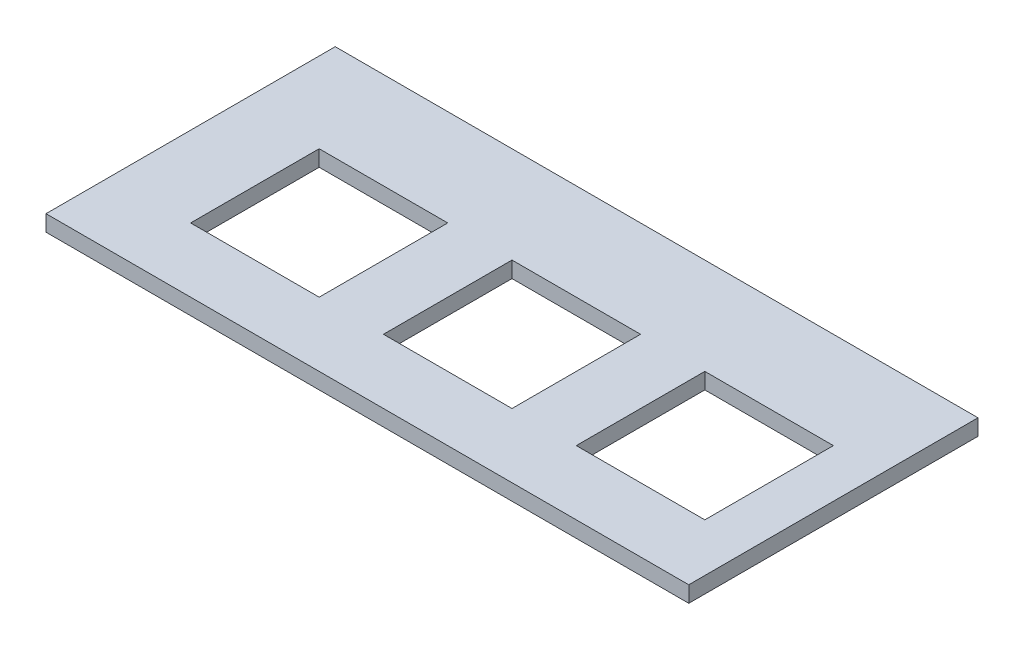
ISO-10303-21;
HEADER;
FILE_DESCRIPTION(('STEP AP214'),'2;1');
FILE_NAME('part.step','',(''),(''),'','','');
FILE_SCHEMA(('AUTOMOTIVE_DESIGN { 1 0 10303 214 1 1 1 1 }'));
ENDSEC;
DATA;
#1=APPLICATION_CONTEXT('core data for automotive mechanical design processes');
#2=APPLICATION_PROTOCOL_DEFINITION('international standard','automotive_design',2000,#1);
#3=PRODUCT_CONTEXT('',#1,'mechanical');
#4=PRODUCT('Part','Part','',(#3));
#5=PRODUCT_RELATED_PRODUCT_CATEGORY('part','',(#4));
#6=PRODUCT_DEFINITION_FORMATION('','',#4);
#7=PRODUCT_DEFINITION_CONTEXT('part definition',#1,'design');
#8=PRODUCT_DEFINITION('design','',#6,#7);
#9=PRODUCT_DEFINITION_SHAPE('','',#8);
#10=(LENGTH_UNIT() NAMED_UNIT(*) SI_UNIT(.MILLI.,.METRE.));
#11=(NAMED_UNIT(*) PLANE_ANGLE_UNIT() SI_UNIT($,.RADIAN.));
#12=(NAMED_UNIT(*) SI_UNIT($,.STERADIAN.) SOLID_ANGLE_UNIT());
#13=UNCERTAINTY_MEASURE_WITH_UNIT(LENGTH_MEASURE(1.E-05),#10,'distance_accuracy_value','');
#14=(GEOMETRIC_REPRESENTATION_CONTEXT(3) GLOBAL_UNCERTAINTY_ASSIGNED_CONTEXT((#13)) GLOBAL_UNIT_ASSIGNED_CONTEXT((#10,
#11,#12)) REPRESENTATION_CONTEXT('',''));
#15=CARTESIAN_POINT('',(0.,0.,0.));
#16=DIRECTION('',(0.,0.,1.));
#17=DIRECTION('',(1.,0.,0.));
#18=AXIS2_PLACEMENT_3D('',#15,#16,#17);
#19=CARTESIAN_POINT('',(0.,10.,0.));
#20=DIRECTION('',(-1.,0.,0.));
#21=DIRECTION('',(0.,0.,1.));
#22=AXIS2_PLACEMENT_3D('',#19,#20,#21);
#23=PLANE('',#22);
#24=DIRECTION('',(0.,0.,-1.));
#25=VECTOR('',#24,1.);
#26=CARTESIAN_POINT('',(0.,0.,0.));
#27=LINE('',#26,#25);
#28=CARTESIAN_POINT('',(0.,0.,0.));
#29=VERTEX_POINT('',#28);
#30=CARTESIAN_POINT('',(0.,0.,-180.));
#31=VERTEX_POINT('',#30);
#32=EDGE_CURVE('E238',#29,#31,#27,.T.);
#33=ORIENTED_EDGE('',*,*,#32,.T.);
#34=DIRECTION('',(0.,-1.,0.));
#35=VECTOR('',#34,1.);
#36=CARTESIAN_POINT('',(0.,10.,-180.));
#37=LINE('',#36,#35);
#38=CARTESIAN_POINT('',(0.,10.,-180.));
#39=VERTEX_POINT('',#38);
#40=EDGE_CURVE('E11',#39,#31,#37,.T.);
#41=ORIENTED_EDGE('',*,*,#40,.F.);
#42=DIRECTION('',(0.,0.,-1.));
#43=VECTOR('',#42,1.);
#44=CARTESIAN_POINT('',(0.,10.,0.));
#45=LINE('',#44,#43);
#46=CARTESIAN_POINT('',(0.,10.,0.));
#47=VERTEX_POINT('',#46);
#48=EDGE_CURVE('E245',#47,#39,#45,.T.);
#49=ORIENTED_EDGE('',*,*,#48,.F.);
#50=DIRECTION('',(0.,-1.,0.));
#51=VECTOR('',#50,1.);
#52=CARTESIAN_POINT('',(0.,10.,0.));
#53=LINE('',#52,#51);
#54=EDGE_CURVE('E255',#47,#29,#53,.T.);
#55=ORIENTED_EDGE('',*,*,#54,.T.);
#56=EDGE_LOOP('',(#33,#41,#49,#55));
#57=FACE_BOUND('',#56,.T.);
#58=ADVANCED_FACE('F32',(#57),#23,.F.);
#59=CARTESIAN_POINT('',(0.,10.,-180.));
#60=DIRECTION('',(0.,0.,1.));
#61=DIRECTION('',(1.,0.,0.));
#62=AXIS2_PLACEMENT_3D('',#59,#60,#61);
#63=PLANE('',#62);
#64=DIRECTION('',(-1.,0.,0.));
#65=VECTOR('',#64,1.);
#66=CARTESIAN_POINT('',(0.,0.,-180.));
#67=LINE('',#66,#65);
#68=CARTESIAN_POINT('',(-400.,0.,-180.));
#69=VERTEX_POINT('',#68);
#70=EDGE_CURVE('E258',#31,#69,#67,.T.);
#71=ORIENTED_EDGE('',*,*,#70,.T.);
#72=DIRECTION('',(0.,-1.,0.));
#73=VECTOR('',#72,1.);
#74=CARTESIAN_POINT('',(-400.,10.,-180.));
#75=LINE('',#74,#73);
#76=CARTESIAN_POINT('',(-400.,10.,-180.));
#77=VERTEX_POINT('',#76);
#78=EDGE_CURVE('E39',#77,#69,#75,.T.);
#79=ORIENTED_EDGE('',*,*,#78,.F.);
#80=DIRECTION('',(-1.,0.,0.));
#81=VECTOR('',#80,1.);
#82=CARTESIAN_POINT('',(0.,10.,-180.));
#83=LINE('',#82,#81);
#84=EDGE_CURVE('E248',#39,#77,#83,.T.);
#85=ORIENTED_EDGE('',*,*,#84,.F.);
#86=ORIENTED_EDGE('',*,*,#40,.T.);
#87=EDGE_LOOP('',(#71,#79,#85,#86));
#88=FACE_BOUND('',#87,.T.);
#89=ADVANCED_FACE('F287',(#88),#63,.F.);
#90=CARTESIAN_POINT('',(-400.,10.,0.));
#91=DIRECTION('',(1.,0.,0.));
#92=DIRECTION('',(0.,0.,-1.));
#93=AXIS2_PLACEMENT_3D('',#90,#91,#92);
#94=PLANE('',#93);
#95=DIRECTION('',(0.,0.,1.));
#96=VECTOR('',#95,1.);
#97=CARTESIAN_POINT('',(-400.,0.,0.));
#98=LINE('',#97,#96);
#99=CARTESIAN_POINT('',(-400.,0.,0.));
#100=VERTEX_POINT('',#99);
#101=EDGE_CURVE('E260',#69,#100,#98,.T.);
#102=ORIENTED_EDGE('',*,*,#101,.T.);
#103=DIRECTION('',(0.,-1.,0.));
#104=VECTOR('',#103,1.);
#105=CARTESIAN_POINT('',(-400.,10.,0.));
#106=LINE('',#105,#104);
#107=CARTESIAN_POINT('',(-400.,10.,0.));
#108=VERTEX_POINT('',#107);
#109=EDGE_CURVE('E265',#108,#100,#106,.T.);
#110=ORIENTED_EDGE('',*,*,#109,.F.);
#111=DIRECTION('',(0.,0.,1.));
#112=VECTOR('',#111,1.);
#113=CARTESIAN_POINT('',(-400.,10.,0.));
#114=LINE('',#113,#112);
#115=EDGE_CURVE('E251',#77,#108,#114,.T.);
#116=ORIENTED_EDGE('',*,*,#115,.F.);
#117=ORIENTED_EDGE('',*,*,#78,.T.);
#118=EDGE_LOOP('',(#102,#110,#116,#117));
#119=FACE_BOUND('',#118,.T.);
#120=ADVANCED_FACE('F272',(#119),#94,.F.);
#121=CARTESIAN_POINT('',(0.,10.,0.));
#122=DIRECTION('',(0.,0.,-1.));
#123=DIRECTION('',(-1.,0.,0.));
#124=AXIS2_PLACEMENT_3D('',#121,#122,#123);
#125=PLANE('',#124);
#126=DIRECTION('',(1.,0.,0.));
#127=VECTOR('',#126,1.);
#128=CARTESIAN_POINT('',(0.,0.,0.));
#129=LINE('',#128,#127);
#130=EDGE_CURVE('E249',#100,#29,#129,.T.);
#131=ORIENTED_EDGE('',*,*,#130,.T.);
#132=ORIENTED_EDGE('',*,*,#54,.F.);
#133=DIRECTION('',(1.,0.,0.));
#134=VECTOR('',#133,1.);
#135=CARTESIAN_POINT('',(0.,10.,0.));
#136=LINE('',#135,#134);
#137=EDGE_CURVE('E253',#108,#47,#136,.T.);
#138=ORIENTED_EDGE('',*,*,#137,.F.);
#139=ORIENTED_EDGE('',*,*,#109,.T.);
#140=EDGE_LOOP('',(#131,#132,#138,#139));
#141=FACE_BOUND('',#140,.T.);
#142=ADVANCED_FACE('F280',(#141),#125,.F.);
#143=CARTESIAN_POINT('',(0.,10.,0.));
#144=DIRECTION('',(0.,1.,0.));
#145=DIRECTION('',(0.,0.,1.));
#146=AXIS2_PLACEMENT_3D('',#143,#144,#145);
#147=PLANE('',#146);
#148=DIRECTION('',(0.,0.,1.));
#149=VECTOR('',#148,1.);
#150=CARTESIAN_POINT('',(-110.,10.,-120.));
#151=LINE('',#150,#149);
#152=CARTESIAN_POINT('',(-110.,10.,-120.));
#153=VERTEX_POINT('',#152);
#154=CARTESIAN_POINT('',(-110.,10.,-40.));
#155=VERTEX_POINT('',#154);
#156=EDGE_CURVE('E46',#153,#155,#151,.T.);
#157=ORIENTED_EDGE('',*,*,#156,.F.);
#158=DIRECTION('',(-1.,0.,0.));
#159=VECTOR('',#158,1.);
#160=CARTESIAN_POINT('',(-110.,10.,-120.));
#161=LINE('',#160,#159);
#162=CARTESIAN_POINT('',(-30.,10.,-120.));
#163=VERTEX_POINT('',#162);
#164=EDGE_CURVE('E162',#163,#153,#161,.T.);
#165=ORIENTED_EDGE('',*,*,#164,.F.);
#166=DIRECTION('',(0.,0.,-1.));
#167=VECTOR('',#166,1.);
#168=CARTESIAN_POINT('',(-30.,10.,-120.));
#169=LINE('',#168,#167);
#170=CARTESIAN_POINT('',(-29.9999999999999,10.,-40.));
#171=VERTEX_POINT('',#170);
#172=EDGE_CURVE('E165',#171,#163,#169,.T.);
#173=ORIENTED_EDGE('',*,*,#172,.F.);
#174=DIRECTION('',(1.,0.,0.));
#175=VECTOR('',#174,1.);
#176=CARTESIAN_POINT('',(-110.,10.,-40.));
#177=LINE('',#176,#175);
#178=EDGE_CURVE('E171',#155,#171,#177,.T.);
#179=ORIENTED_EDGE('',*,*,#178,.F.);
#180=EDGE_LOOP('',(#157,#165,#173,#179));
#181=FACE_BOUND('',#180,.T.);
#182=DIRECTION('',(0.,0.,1.));
#183=VECTOR('',#182,1.);
#184=CARTESIAN_POINT('',(-230.,10.,-120.));
#185=LINE('',#184,#183);
#186=CARTESIAN_POINT('',(-230.,10.,-120.));
#187=VERTEX_POINT('',#186);
#188=CARTESIAN_POINT('',(-230.,10.,-40.));
#189=VERTEX_POINT('',#188);
#190=EDGE_CURVE('E177',#187,#189,#185,.T.);
#191=ORIENTED_EDGE('',*,*,#190,.F.);
#192=DIRECTION('',(-1.,0.,0.));
#193=VECTOR('',#192,1.);
#194=CARTESIAN_POINT('',(-230.,10.,-120.));
#195=LINE('',#194,#193);
#196=CARTESIAN_POINT('',(-150.,10.,-120.));
#197=VERTEX_POINT('',#196);
#198=EDGE_CURVE('E185',#197,#187,#195,.T.);
#199=ORIENTED_EDGE('',*,*,#198,.F.);
#200=DIRECTION('',(0.,0.,-1.));
#201=VECTOR('',#200,1.);
#202=CARTESIAN_POINT('',(-150.,10.,-120.));
#203=LINE('',#202,#201);
#204=CARTESIAN_POINT('',(-150.,10.,-40.));
#205=VERTEX_POINT('',#204);
#206=EDGE_CURVE('E199',#205,#197,#203,.T.);
#207=ORIENTED_EDGE('',*,*,#206,.F.);
#208=DIRECTION('',(1.,0.,0.));
#209=VECTOR('',#208,1.);
#210=CARTESIAN_POINT('',(-230.,10.,-40.));
#211=LINE('',#210,#209);
#212=EDGE_CURVE('E196',#189,#205,#211,.T.);
#213=ORIENTED_EDGE('',*,*,#212,.F.);
#214=EDGE_LOOP('',(#191,#199,#207,#213));
#215=FACE_BOUND('',#214,.T.);
#216=DIRECTION('',(0.,0.,1.));
#217=VECTOR('',#216,1.);
#218=CARTESIAN_POINT('',(-350.,10.,-120.));
#219=LINE('',#218,#217);
#220=CARTESIAN_POINT('',(-350.,10.,-120.));
#221=VERTEX_POINT('',#220);
#222=CARTESIAN_POINT('',(-350.,10.,-40.));
#223=VERTEX_POINT('',#222);
#224=EDGE_CURVE('E206',#221,#223,#219,.T.);
#225=ORIENTED_EDGE('',*,*,#224,.F.);
#226=DIRECTION('',(-1.,0.,0.));
#227=VECTOR('',#226,1.);
#228=CARTESIAN_POINT('',(-350.,10.,-120.));
#229=LINE('',#228,#227);
#230=CARTESIAN_POINT('',(-270.,10.,-120.));
#231=VERTEX_POINT('',#230);
#232=EDGE_CURVE('E217',#231,#221,#229,.T.);
#233=ORIENTED_EDGE('',*,*,#232,.F.);
#234=DIRECTION('',(0.,0.,-1.));
#235=VECTOR('',#234,1.);
#236=CARTESIAN_POINT('',(-270.,10.,-120.));
#237=LINE('',#236,#235);
#238=CARTESIAN_POINT('',(-270.,10.,-40.));
#239=VERTEX_POINT('',#238);
#240=EDGE_CURVE('E231',#239,#231,#237,.T.);
#241=ORIENTED_EDGE('',*,*,#240,.F.);
#242=DIRECTION('',(1.,0.,0.));
#243=VECTOR('',#242,1.);
#244=CARTESIAN_POINT('',(-350.,10.,-40.));
#245=LINE('',#244,#243);
#246=EDGE_CURVE('E228',#223,#239,#245,.T.);
#247=ORIENTED_EDGE('',*,*,#246,.F.);
#248=EDGE_LOOP('',(#225,#233,#241,#247));
#249=FACE_BOUND('',#248,.T.);
#250=ORIENTED_EDGE('',*,*,#48,.T.);
#251=ORIENTED_EDGE('',*,*,#84,.T.);
#252=ORIENTED_EDGE('',*,*,#115,.T.);
#253=ORIENTED_EDGE('',*,*,#137,.T.);
#254=EDGE_LOOP('',(#250,#251,#252,#253));
#255=FACE_BOUND('',#254,.T.);
#256=ADVANCED_FACE('F286',(#181,#215,#249,#255),#147,.T.);
#257=CARTESIAN_POINT('',(0.,0.,0.));
#258=DIRECTION('',(0.,1.,0.));
#259=DIRECTION('',(0.,0.,1.));
#260=AXIS2_PLACEMENT_3D('',#257,#258,#259);
#261=PLANE('',#260);
#262=DIRECTION('',(-1.,0.,0.));
#263=VECTOR('',#262,1.);
#264=CARTESIAN_POINT('',(-110.,0.,-120.));
#265=LINE('',#264,#263);
#266=CARTESIAN_POINT('',(-30.,0.,-120.));
#267=VERTEX_POINT('',#266);
#268=CARTESIAN_POINT('',(-110.,0.,-120.));
#269=VERTEX_POINT('',#268);
#270=EDGE_CURVE('E152',#267,#269,#265,.T.);
#271=ORIENTED_EDGE('',*,*,#270,.T.);
#272=DIRECTION('',(0.,0.,1.));
#273=VECTOR('',#272,1.);
#274=CARTESIAN_POINT('',(-110.,0.,-120.));
#275=LINE('',#274,#273);
#276=CARTESIAN_POINT('',(-110.,0.,-40.));
#277=VERTEX_POINT('',#276);
#278=EDGE_CURVE('E146',#269,#277,#275,.T.);
#279=ORIENTED_EDGE('',*,*,#278,.T.);
#280=DIRECTION('',(1.,0.,0.));
#281=VECTOR('',#280,1.);
#282=CARTESIAN_POINT('',(-110.,0.,-40.));
#283=LINE('',#282,#281);
#284=CARTESIAN_POINT('',(-29.9999999999999,0.,-40.));
#285=VERTEX_POINT('',#284);
#286=EDGE_CURVE('E155',#277,#285,#283,.T.);
#287=ORIENTED_EDGE('',*,*,#286,.T.);
#288=DIRECTION('',(0.,0.,-1.));
#289=VECTOR('',#288,1.);
#290=CARTESIAN_POINT('',(-30.,0.,-120.));
#291=LINE('',#290,#289);
#292=EDGE_CURVE('E54',#285,#267,#291,.T.);
#293=ORIENTED_EDGE('',*,*,#292,.T.);
#294=EDGE_LOOP('',(#271,#279,#287,#293));
#295=FACE_BOUND('',#294,.T.);
#296=DIRECTION('',(-1.,0.,0.));
#297=VECTOR('',#296,1.);
#298=CARTESIAN_POINT('',(-230.,0.,-120.));
#299=LINE('',#298,#297);
#300=CARTESIAN_POINT('',(-150.,0.,-120.));
#301=VERTEX_POINT('',#300);
#302=CARTESIAN_POINT('',(-230.,0.,-120.));
#303=VERTEX_POINT('',#302);
#304=EDGE_CURVE('E191',#301,#303,#299,.T.);
#305=ORIENTED_EDGE('',*,*,#304,.T.);
#306=DIRECTION('',(0.,0.,1.));
#307=VECTOR('',#306,1.);
#308=CARTESIAN_POINT('',(-230.,0.,-120.));
#309=LINE('',#308,#307);
#310=CARTESIAN_POINT('',(-230.,0.,-40.));
#311=VERTEX_POINT('',#310);
#312=EDGE_CURVE('E181',#303,#311,#309,.T.);
#313=ORIENTED_EDGE('',*,*,#312,.T.);
#314=DIRECTION('',(1.,0.,0.));
#315=VECTOR('',#314,1.);
#316=CARTESIAN_POINT('',(-230.,0.,-40.));
#317=LINE('',#316,#315);
#318=CARTESIAN_POINT('',(-150.,0.,-40.));
#319=VERTEX_POINT('',#318);
#320=EDGE_CURVE('E184',#311,#319,#317,.T.);
#321=ORIENTED_EDGE('',*,*,#320,.T.);
#322=DIRECTION('',(0.,0.,-1.));
#323=VECTOR('',#322,1.);
#324=CARTESIAN_POINT('',(-150.,0.,-120.));
#325=LINE('',#324,#323);
#326=EDGE_CURVE('E188',#319,#301,#325,.T.);
#327=ORIENTED_EDGE('',*,*,#326,.T.);
#328=EDGE_LOOP('',(#305,#313,#321,#327));
#329=FACE_BOUND('',#328,.T.);
#330=DIRECTION('',(-1.,0.,0.));
#331=VECTOR('',#330,1.);
#332=CARTESIAN_POINT('',(-350.,0.,-120.));
#333=LINE('',#332,#331);
#334=CARTESIAN_POINT('',(-270.,0.,-120.));
#335=VERTEX_POINT('',#334);
#336=CARTESIAN_POINT('',(-350.,0.,-120.));
#337=VERTEX_POINT('',#336);
#338=EDGE_CURVE('E223',#335,#337,#333,.T.);
#339=ORIENTED_EDGE('',*,*,#338,.T.);
#340=DIRECTION('',(0.,0.,1.));
#341=VECTOR('',#340,1.);
#342=CARTESIAN_POINT('',(-350.,0.,-120.));
#343=LINE('',#342,#341);
#344=CARTESIAN_POINT('',(-350.,0.,-40.));
#345=VERTEX_POINT('',#344);
#346=EDGE_CURVE('E213',#337,#345,#343,.T.);
#347=ORIENTED_EDGE('',*,*,#346,.T.);
#348=DIRECTION('',(1.,0.,0.));
#349=VECTOR('',#348,1.);
#350=CARTESIAN_POINT('',(-350.,0.,-40.));
#351=LINE('',#350,#349);
#352=CARTESIAN_POINT('',(-270.,0.,-40.));
#353=VERTEX_POINT('',#352);
#354=EDGE_CURVE('E216',#345,#353,#351,.T.);
#355=ORIENTED_EDGE('',*,*,#354,.T.);
#356=DIRECTION('',(0.,0.,-1.));
#357=VECTOR('',#356,1.);
#358=CARTESIAN_POINT('',(-270.,0.,-120.));
#359=LINE('',#358,#357);
#360=EDGE_CURVE('E220',#353,#335,#359,.T.);
#361=ORIENTED_EDGE('',*,*,#360,.T.);
#362=EDGE_LOOP('',(#339,#347,#355,#361));
#363=FACE_BOUND('',#362,.T.);
#364=ORIENTED_EDGE('',*,*,#32,.F.);
#365=ORIENTED_EDGE('',*,*,#130,.F.);
#366=ORIENTED_EDGE('',*,*,#101,.F.);
#367=ORIENTED_EDGE('',*,*,#70,.F.);
#368=EDGE_LOOP('',(#364,#365,#366,#367));
#369=FACE_BOUND('',#368,.T.);
#370=ADVANCED_FACE('F159',(#295,#329,#363,#369),#261,.F.);
#371=CARTESIAN_POINT('',(-350.,0.,-120.));
#372=DIRECTION('',(-1.,0.,0.));
#373=DIRECTION('',(0.,0.,1.));
#374=AXIS2_PLACEMENT_3D('',#371,#372,#373);
#375=PLANE('',#374);
#376=ORIENTED_EDGE('',*,*,#224,.T.);
#377=DIRECTION('',(0.,1.,0.));
#378=VECTOR('',#377,1.);
#379=CARTESIAN_POINT('',(-350.,0.,-40.));
#380=LINE('',#379,#378);
#381=EDGE_CURVE('E226',#345,#223,#380,.T.);
#382=ORIENTED_EDGE('',*,*,#381,.F.);
#383=ORIENTED_EDGE('',*,*,#346,.F.);
#384=DIRECTION('',(0.,1.,0.));
#385=VECTOR('',#384,1.);
#386=CARTESIAN_POINT('',(-350.,0.,-120.));
#387=LINE('',#386,#385);
#388=EDGE_CURVE('E236',#337,#221,#387,.T.);
#389=ORIENTED_EDGE('',*,*,#388,.T.);
#390=EDGE_LOOP('',(#376,#382,#383,#389));
#391=FACE_BOUND('',#390,.T.);
#392=ADVANCED_FACE('F299',(#391),#375,.F.);
#393=CARTESIAN_POINT('',(-350.,0.,-120.));
#394=DIRECTION('',(0.,0.,-1.));
#395=DIRECTION('',(-1.,0.,0.));
#396=AXIS2_PLACEMENT_3D('',#393,#394,#395);
#397=PLANE('',#396);
#398=ORIENTED_EDGE('',*,*,#232,.T.);
#399=ORIENTED_EDGE('',*,*,#388,.F.);
#400=ORIENTED_EDGE('',*,*,#338,.F.);
#401=DIRECTION('',(0.,1.,0.));
#402=VECTOR('',#401,1.);
#403=CARTESIAN_POINT('',(-270.,0.,-120.));
#404=LINE('',#403,#402);
#405=EDGE_CURVE('E239',#335,#231,#404,.T.);
#406=ORIENTED_EDGE('',*,*,#405,.T.);
#407=EDGE_LOOP('',(#398,#399,#400,#406));
#408=FACE_BOUND('',#407,.T.);
#409=ADVANCED_FACE('F305',(#408),#397,.F.);
#410=CARTESIAN_POINT('',(-270.,0.,-120.));
#411=DIRECTION('',(1.,0.,0.));
#412=DIRECTION('',(0.,0.,-1.));
#413=AXIS2_PLACEMENT_3D('',#410,#411,#412);
#414=PLANE('',#413);
#415=ORIENTED_EDGE('',*,*,#240,.T.);
#416=ORIENTED_EDGE('',*,*,#405,.F.);
#417=ORIENTED_EDGE('',*,*,#360,.F.);
#418=DIRECTION('',(0.,1.,0.));
#419=VECTOR('',#418,1.);
#420=CARTESIAN_POINT('',(-270.,0.,-40.));
#421=LINE('',#420,#419);
#422=EDGE_CURVE('E241',#353,#239,#421,.T.);
#423=ORIENTED_EDGE('',*,*,#422,.T.);
#424=EDGE_LOOP('',(#415,#416,#417,#423));
#425=FACE_BOUND('',#424,.T.);
#426=ADVANCED_FACE('F311',(#425),#414,.F.);
#427=CARTESIAN_POINT('',(-350.,0.,-40.));
#428=DIRECTION('',(0.,0.,1.));
#429=DIRECTION('',(1.,0.,0.));
#430=AXIS2_PLACEMENT_3D('',#427,#428,#429);
#431=PLANE('',#430);
#432=ORIENTED_EDGE('',*,*,#246,.T.);
#433=ORIENTED_EDGE('',*,*,#422,.F.);
#434=ORIENTED_EDGE('',*,*,#354,.F.);
#435=ORIENTED_EDGE('',*,*,#381,.T.);
#436=EDGE_LOOP('',(#432,#433,#434,#435));
#437=FACE_BOUND('',#436,.T.);
#438=ADVANCED_FACE('F307',(#437),#431,.F.);
#439=CARTESIAN_POINT('',(-230.,0.,-120.));
#440=DIRECTION('',(-1.,0.,0.));
#441=DIRECTION('',(0.,0.,1.));
#442=AXIS2_PLACEMENT_3D('',#439,#440,#441);
#443=PLANE('',#442);
#444=ORIENTED_EDGE('',*,*,#190,.T.);
#445=DIRECTION('',(0.,1.,0.));
#446=VECTOR('',#445,1.);
#447=CARTESIAN_POINT('',(-230.,0.,-40.));
#448=LINE('',#447,#446);
#449=EDGE_CURVE('E194',#311,#189,#448,.T.);
#450=ORIENTED_EDGE('',*,*,#449,.F.);
#451=ORIENTED_EDGE('',*,*,#312,.F.);
#452=DIRECTION('',(0.,1.,0.));
#453=VECTOR('',#452,1.);
#454=CARTESIAN_POINT('',(-230.,0.,-120.));
#455=LINE('',#454,#453);
#456=EDGE_CURVE('E204',#303,#187,#455,.T.);
#457=ORIENTED_EDGE('',*,*,#456,.T.);
#458=EDGE_LOOP('',(#444,#450,#451,#457));
#459=FACE_BOUND('',#458,.T.);
#460=ADVANCED_FACE('F310',(#459),#443,.F.);
#461=CARTESIAN_POINT('',(-230.,0.,-120.));
#462=DIRECTION('',(0.,0.,-1.));
#463=DIRECTION('',(-1.,0.,0.));
#464=AXIS2_PLACEMENT_3D('',#461,#462,#463);
#465=PLANE('',#464);
#466=ORIENTED_EDGE('',*,*,#198,.T.);
#467=ORIENTED_EDGE('',*,*,#456,.F.);
#468=ORIENTED_EDGE('',*,*,#304,.F.);
#469=DIRECTION('',(0.,1.,0.));
#470=VECTOR('',#469,1.);
#471=CARTESIAN_POINT('',(-150.,0.,-120.));
#472=LINE('',#471,#470);
#473=EDGE_CURVE('E207',#301,#197,#472,.T.);
#474=ORIENTED_EDGE('',*,*,#473,.T.);
#475=EDGE_LOOP('',(#466,#467,#468,#474));
#476=FACE_BOUND('',#475,.T.);
#477=ADVANCED_FACE('F321',(#476),#465,.F.);
#478=CARTESIAN_POINT('',(-150.,0.,-120.));
#479=DIRECTION('',(1.,0.,0.));
#480=DIRECTION('',(0.,0.,-1.));
#481=AXIS2_PLACEMENT_3D('',#478,#479,#480);
#482=PLANE('',#481);
#483=ORIENTED_EDGE('',*,*,#206,.T.);
#484=ORIENTED_EDGE('',*,*,#473,.F.);
#485=ORIENTED_EDGE('',*,*,#326,.F.);
#486=DIRECTION('',(0.,1.,0.));
#487=VECTOR('',#486,1.);
#488=CARTESIAN_POINT('',(-150.,0.,-40.));
#489=LINE('',#488,#487);
#490=EDGE_CURVE('E209',#319,#205,#489,.T.);
#491=ORIENTED_EDGE('',*,*,#490,.T.);
#492=EDGE_LOOP('',(#483,#484,#485,#491));
#493=FACE_BOUND('',#492,.T.);
#494=ADVANCED_FACE('F326',(#493),#482,.F.);
#495=CARTESIAN_POINT('',(-230.,0.,-40.));
#496=DIRECTION('',(0.,0.,1.));
#497=DIRECTION('',(1.,0.,0.));
#498=AXIS2_PLACEMENT_3D('',#495,#496,#497);
#499=PLANE('',#498);
#500=ORIENTED_EDGE('',*,*,#212,.T.);
#501=ORIENTED_EDGE('',*,*,#490,.F.);
#502=ORIENTED_EDGE('',*,*,#320,.F.);
#503=ORIENTED_EDGE('',*,*,#449,.T.);
#504=EDGE_LOOP('',(#500,#501,#502,#503));
#505=FACE_BOUND('',#504,.T.);
#506=ADVANCED_FACE('F323',(#505),#499,.F.);
#507=CARTESIAN_POINT('',(-110.,0.,-120.));
#508=DIRECTION('',(-1.,0.,0.));
#509=DIRECTION('',(0.,0.,1.));
#510=AXIS2_PLACEMENT_3D('',#507,#508,#509);
#511=PLANE('',#510);
#512=ORIENTED_EDGE('',*,*,#156,.T.);
#513=DIRECTION('',(0.,1.,0.));
#514=VECTOR('',#513,1.);
#515=CARTESIAN_POINT('',(-110.,0.,-40.));
#516=LINE('',#515,#514);
#517=EDGE_CURVE('E142',#277,#155,#516,.T.);
#518=ORIENTED_EDGE('',*,*,#517,.F.);
#519=ORIENTED_EDGE('',*,*,#278,.F.);
#520=DIRECTION('',(0.,1.,0.));
#521=VECTOR('',#520,1.);
#522=CARTESIAN_POINT('',(-110.,0.,-120.));
#523=LINE('',#522,#521);
#524=EDGE_CURVE('E175',#269,#153,#523,.T.);
#525=ORIENTED_EDGE('',*,*,#524,.T.);
#526=EDGE_LOOP('',(#512,#518,#519,#525));
#527=FACE_BOUND('',#526,.T.);
#528=ADVANCED_FACE('F144',(#527),#511,.F.);
#529=CARTESIAN_POINT('',(-110.,0.,-120.));
#530=DIRECTION('',(0.,0.,-1.));
#531=DIRECTION('',(-1.,0.,0.));
#532=AXIS2_PLACEMENT_3D('',#529,#530,#531);
#533=PLANE('',#532);
#534=ORIENTED_EDGE('',*,*,#164,.T.);
#535=ORIENTED_EDGE('',*,*,#524,.F.);
#536=ORIENTED_EDGE('',*,*,#270,.F.);
#537=DIRECTION('',(0.,1.,0.));
#538=VECTOR('',#537,1.);
#539=CARTESIAN_POINT('',(-30.,0.,-120.));
#540=LINE('',#539,#538);
#541=EDGE_CURVE('E178',#267,#163,#540,.T.);
#542=ORIENTED_EDGE('',*,*,#541,.T.);
#543=EDGE_LOOP('',(#534,#535,#536,#542));
#544=FACE_BOUND('',#543,.T.);
#545=ADVANCED_FACE('F336',(#544),#533,.F.);
#546=CARTESIAN_POINT('',(-30.,0.,-120.));
#547=DIRECTION('',(1.,0.,0.));
#548=DIRECTION('',(0.,0.,-1.));
#549=AXIS2_PLACEMENT_3D('',#546,#547,#548);
#550=PLANE('',#549);
#551=ORIENTED_EDGE('',*,*,#172,.T.);
#552=ORIENTED_EDGE('',*,*,#541,.F.);
#553=ORIENTED_EDGE('',*,*,#292,.F.);
#554=DIRECTION('',(0.,1.,0.));
#555=VECTOR('',#554,1.);
#556=CARTESIAN_POINT('',(-29.9999999999999,0.,-40.));
#557=LINE('',#556,#555);
#558=EDGE_CURVE('E151',#285,#171,#557,.T.);
#559=ORIENTED_EDGE('',*,*,#558,.T.);
#560=EDGE_LOOP('',(#551,#552,#553,#559));
#561=FACE_BOUND('',#560,.T.);
#562=ADVANCED_FACE('F339',(#561),#550,.F.);
#563=CARTESIAN_POINT('',(-110.,0.,-40.));
#564=DIRECTION('',(0.,0.,1.));
#565=DIRECTION('',(1.,0.,0.));
#566=AXIS2_PLACEMENT_3D('',#563,#564,#565);
#567=PLANE('',#566);
#568=ORIENTED_EDGE('',*,*,#178,.T.);
#569=ORIENTED_EDGE('',*,*,#558,.F.);
#570=ORIENTED_EDGE('',*,*,#286,.F.);
#571=ORIENTED_EDGE('',*,*,#517,.T.);
#572=EDGE_LOOP('',(#568,#569,#570,#571));
#573=FACE_BOUND('',#572,.T.);
#574=ADVANCED_FACE('F156',(#573),#567,.F.);
#575=CLOSED_SHELL('',(#58,#89,#120,#142,#256,#370,#392,#409,#426,#438,#460,#477,#494,#506,#528,
#545,#562,#574));
#576=MANIFOLD_SOLID_BREP('B2',#575);
#577=ADVANCED_BREP_SHAPE_REPRESENTATION('',(#18,#576),#14);
#578=SHAPE_DEFINITION_REPRESENTATION(#9,#577);
ENDSEC;
END-ISO-10303-21;
